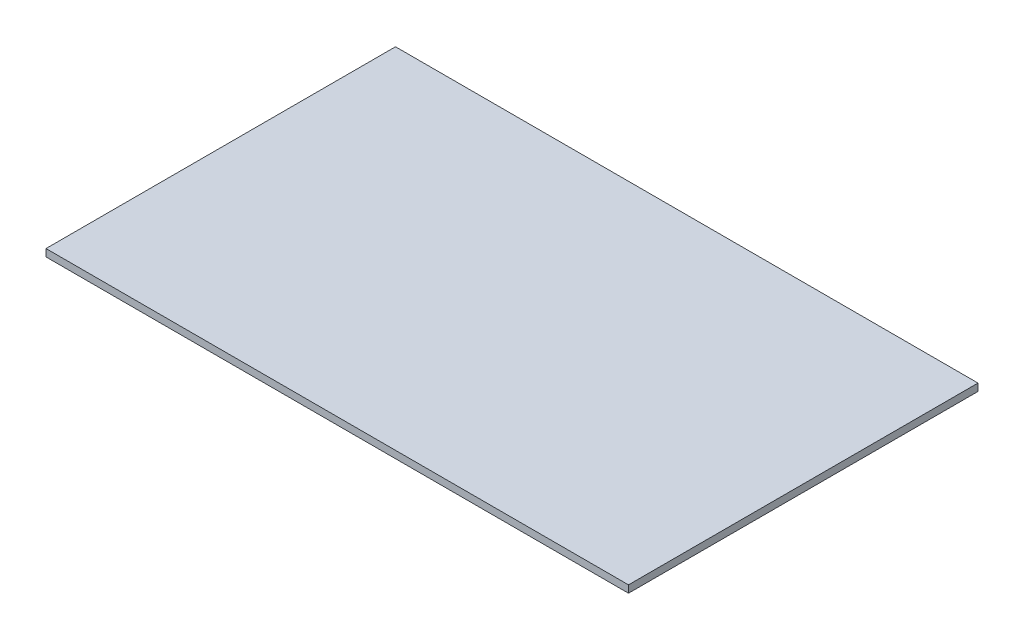
ISO-10303-21;
HEADER;
FILE_DESCRIPTION(('STEP AP214'),'2;1');
FILE_NAME('part.step','',(''),(''),'','','');
FILE_SCHEMA(('AUTOMOTIVE_DESIGN { 1 0 10303 214 1 1 1 1 }'));
ENDSEC;
DATA;
#1=APPLICATION_CONTEXT('core data for automotive mechanical design processes');
#2=APPLICATION_PROTOCOL_DEFINITION('international standard','automotive_design',2000,#1);
#3=PRODUCT_CONTEXT('',#1,'mechanical');
#4=PRODUCT('Part','Part','',(#3));
#5=PRODUCT_RELATED_PRODUCT_CATEGORY('part','',(#4));
#6=PRODUCT_DEFINITION_FORMATION('','',#4);
#7=PRODUCT_DEFINITION_CONTEXT('part definition',#1,'design');
#8=PRODUCT_DEFINITION('design','',#6,#7);
#9=PRODUCT_DEFINITION_SHAPE('','',#8);
#10=(LENGTH_UNIT() NAMED_UNIT(*) SI_UNIT(.MILLI.,.METRE.));
#11=(NAMED_UNIT(*) PLANE_ANGLE_UNIT() SI_UNIT($,.RADIAN.));
#12=(NAMED_UNIT(*) SI_UNIT($,.STERADIAN.) SOLID_ANGLE_UNIT());
#13=UNCERTAINTY_MEASURE_WITH_UNIT(LENGTH_MEASURE(1.E-05),#10,'distance_accuracy_value','');
#14=(GEOMETRIC_REPRESENTATION_CONTEXT(3) GLOBAL_UNCERTAINTY_ASSIGNED_CONTEXT((#13)) GLOBAL_UNIT_ASSIGNED_CONTEXT((#10,
#11,#12)) REPRESENTATION_CONTEXT('',''));
#15=CARTESIAN_POINT('',(0.,0.,0.));
#16=DIRECTION('',(0.,0.,1.));
#17=DIRECTION('',(1.,0.,0.));
#18=AXIS2_PLACEMENT_3D('',#15,#16,#17);
#19=CARTESIAN_POINT('',(254.,3.175,152.4));
#20=DIRECTION('',(-1.,0.,0.));
#21=DIRECTION('',(0.,0.,1.));
#22=AXIS2_PLACEMENT_3D('',#19,#20,#21);
#23=PLANE('',#22);
#24=DIRECTION('',(0.,0.,-1.));
#25=VECTOR('',#24,1.);
#26=CARTESIAN_POINT('',(254.,-3.175,152.4));
#27=LINE('',#26,#25);
#28=CARTESIAN_POINT('',(254.,-3.175,152.4));
#29=VERTEX_POINT('',#28);
#30=CARTESIAN_POINT('',(254.,-3.175,-152.4));
#31=VERTEX_POINT('',#30);
#32=EDGE_CURVE('E107',#29,#31,#27,.T.);
#33=ORIENTED_EDGE('',*,*,#32,.T.);
#34=DIRECTION('',(0.,-1.,0.));
#35=VECTOR('',#34,1.);
#36=CARTESIAN_POINT('',(254.,3.175,-152.4));
#37=LINE('',#36,#35);
#38=CARTESIAN_POINT('',(254.,3.175,-152.4));
#39=VERTEX_POINT('',#38);
#40=EDGE_CURVE('E11',#39,#31,#37,.T.);
#41=ORIENTED_EDGE('',*,*,#40,.F.);
#42=DIRECTION('',(0.,0.,-1.));
#43=VECTOR('',#42,1.);
#44=CARTESIAN_POINT('',(254.,3.175,152.4));
#45=LINE('',#44,#43);
#46=CARTESIAN_POINT('',(254.,3.175,152.4));
#47=VERTEX_POINT('',#46);
#48=EDGE_CURVE('E91',#47,#39,#45,.T.);
#49=ORIENTED_EDGE('',*,*,#48,.F.);
#50=DIRECTION('',(0.,-1.,0.));
#51=VECTOR('',#50,1.);
#52=CARTESIAN_POINT('',(254.,3.175,152.4));
#53=LINE('',#52,#51);
#54=EDGE_CURVE('E103',#47,#29,#53,.T.);
#55=ORIENTED_EDGE('',*,*,#54,.T.);
#56=EDGE_LOOP('',(#33,#41,#49,#55));
#57=FACE_BOUND('',#56,.T.);
#58=ADVANCED_FACE('F39',(#57),#23,.F.);
#59=CARTESIAN_POINT('',(-254.,3.175,-152.4));
#60=DIRECTION('',(0.,0.,1.));
#61=DIRECTION('',(1.,0.,0.));
#62=AXIS2_PLACEMENT_3D('',#59,#60,#61);
#63=PLANE('',#62);
#64=DIRECTION('',(-1.,0.,0.));
#65=VECTOR('',#64,1.);
#66=CARTESIAN_POINT('',(-254.,-3.175,-152.4));
#67=LINE('',#66,#65);
#68=CARTESIAN_POINT('',(-254.,-3.175,-152.4));
#69=VERTEX_POINT('',#68);
#70=EDGE_CURVE('E96',#31,#69,#67,.T.);
#71=ORIENTED_EDGE('',*,*,#70,.T.);
#72=DIRECTION('',(0.,-1.,0.));
#73=VECTOR('',#72,1.);
#74=CARTESIAN_POINT('',(-254.,3.175,-152.4));
#75=LINE('',#74,#73);
#76=CARTESIAN_POINT('',(-254.,3.175,-152.4));
#77=VERTEX_POINT('',#76);
#78=EDGE_CURVE('E48',#77,#69,#75,.T.);
#79=ORIENTED_EDGE('',*,*,#78,.F.);
#80=DIRECTION('',(-1.,0.,0.));
#81=VECTOR('',#80,1.);
#82=CARTESIAN_POINT('',(-254.,3.175,-152.4));
#83=LINE('',#82,#81);
#84=EDGE_CURVE('E86',#39,#77,#83,.T.);
#85=ORIENTED_EDGE('',*,*,#84,.F.);
#86=ORIENTED_EDGE('',*,*,#40,.T.);
#87=EDGE_LOOP('',(#71,#79,#85,#86));
#88=FACE_BOUND('',#87,.T.);
#89=ADVANCED_FACE('F95',(#88),#63,.F.);
#90=CARTESIAN_POINT('',(-254.,3.175,152.4));
#91=DIRECTION('',(1.,0.,0.));
#92=DIRECTION('',(0.,0.,-1.));
#93=AXIS2_PLACEMENT_3D('',#90,#91,#92);
#94=PLANE('',#93);
#95=DIRECTION('',(0.,0.,1.));
#96=VECTOR('',#95,1.);
#97=CARTESIAN_POINT('',(-254.,-3.175,152.4));
#98=LINE('',#97,#96);
#99=CARTESIAN_POINT('',(-254.,-3.175,152.4));
#100=VERTEX_POINT('',#99);
#101=EDGE_CURVE('E73',#69,#100,#98,.T.);
#102=ORIENTED_EDGE('',*,*,#101,.T.);
#103=DIRECTION('',(0.,-1.,0.));
#104=VECTOR('',#103,1.);
#105=CARTESIAN_POINT('',(-254.,3.175,152.4));
#106=LINE('',#105,#104);
#107=CARTESIAN_POINT('',(-254.,3.175,152.4));
#108=VERTEX_POINT('',#107);
#109=EDGE_CURVE('E98',#108,#100,#106,.T.);
#110=ORIENTED_EDGE('',*,*,#109,.F.);
#111=DIRECTION('',(0.,0.,1.));
#112=VECTOR('',#111,1.);
#113=CARTESIAN_POINT('',(-254.,3.175,152.4));
#114=LINE('',#113,#112);
#115=EDGE_CURVE('E89',#77,#108,#114,.T.);
#116=ORIENTED_EDGE('',*,*,#115,.F.);
#117=ORIENTED_EDGE('',*,*,#78,.T.);
#118=EDGE_LOOP('',(#102,#110,#116,#117));
#119=FACE_BOUND('',#118,.T.);
#120=ADVANCED_FACE('F99',(#119),#94,.F.);
#121=CARTESIAN_POINT('',(-254.,3.175,152.4));
#122=DIRECTION('',(0.,0.,-1.));
#123=DIRECTION('',(-1.,0.,0.));
#124=AXIS2_PLACEMENT_3D('',#121,#122,#123);
#125=PLANE('',#124);
#126=DIRECTION('',(1.,0.,0.));
#127=VECTOR('',#126,1.);
#128=CARTESIAN_POINT('',(-254.,-3.175,152.4));
#129=LINE('',#128,#127);
#130=EDGE_CURVE('E79',#100,#29,#129,.T.);
#131=ORIENTED_EDGE('',*,*,#130,.T.);
#132=ORIENTED_EDGE('',*,*,#54,.F.);
#133=DIRECTION('',(1.,0.,0.));
#134=VECTOR('',#133,1.);
#135=CARTESIAN_POINT('',(-254.,3.175,152.4));
#136=LINE('',#135,#134);
#137=EDGE_CURVE('E56',#108,#47,#136,.T.);
#138=ORIENTED_EDGE('',*,*,#137,.F.);
#139=ORIENTED_EDGE('',*,*,#109,.T.);
#140=EDGE_LOOP('',(#131,#132,#138,#139));
#141=FACE_BOUND('',#140,.T.);
#142=ADVANCED_FACE('F120',(#141),#125,.F.);
#143=CARTESIAN_POINT('',(0.,3.175,0.));
#144=DIRECTION('',(0.,-1.,0.));
#145=DIRECTION('',(0.,0.,-1.));
#146=AXIS2_PLACEMENT_3D('',#143,#144,#145);
#147=PLANE('',#146);
#148=ORIENTED_EDGE('',*,*,#48,.T.);
#149=ORIENTED_EDGE('',*,*,#84,.T.);
#150=ORIENTED_EDGE('',*,*,#115,.T.);
#151=ORIENTED_EDGE('',*,*,#137,.T.);
#152=EDGE_LOOP('',(#148,#149,#150,#151));
#153=FACE_BOUND('',#152,.T.);
#154=ADVANCED_FACE('F87',(#153),#147,.F.);
#155=CARTESIAN_POINT('',(0.,-3.175,0.));
#156=DIRECTION('',(0.,-1.,0.));
#157=DIRECTION('',(0.,0.,-1.));
#158=AXIS2_PLACEMENT_3D('',#155,#156,#157);
#159=PLANE('',#158);
#160=ORIENTED_EDGE('',*,*,#32,.F.);
#161=ORIENTED_EDGE('',*,*,#130,.F.);
#162=ORIENTED_EDGE('',*,*,#101,.F.);
#163=ORIENTED_EDGE('',*,*,#70,.F.);
#164=EDGE_LOOP('',(#160,#161,#162,#163));
#165=FACE_BOUND('',#164,.T.);
#166=ADVANCED_FACE('F123',(#165),#159,.T.);
#167=CLOSED_SHELL('',(#58,#89,#120,#142,#154,#166));
#168=MANIFOLD_SOLID_BREP('B2',#167);
#169=ADVANCED_BREP_SHAPE_REPRESENTATION('',(#18,#168),#14);
#170=SHAPE_DEFINITION_REPRESENTATION(#9,#169);
ENDSEC;
END-ISO-10303-21;
